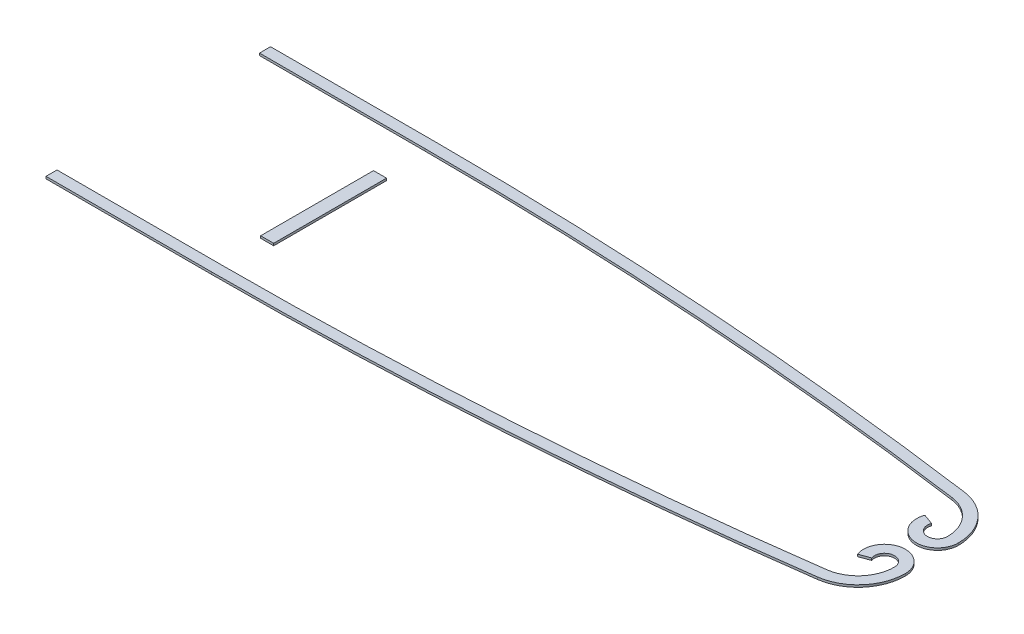
ISO-10303-21;
HEADER;
FILE_DESCRIPTION(('STEP AP214'),'2;1');
FILE_NAME('part.step','',(''),(''),'','','');
FILE_SCHEMA(('AUTOMOTIVE_DESIGN { 1 0 10303 214 1 1 1 1 }'));
ENDSEC;
DATA;
#1=APPLICATION_CONTEXT('core data for automotive mechanical design processes');
#2=APPLICATION_PROTOCOL_DEFINITION('international standard','automotive_design',2000,#1);
#3=PRODUCT_CONTEXT('',#1,'mechanical');
#4=PRODUCT('Part','Part','',(#3));
#5=PRODUCT_RELATED_PRODUCT_CATEGORY('part','',(#4));
#6=PRODUCT_DEFINITION_FORMATION('','',#4);
#7=PRODUCT_DEFINITION_CONTEXT('part definition',#1,'design');
#8=PRODUCT_DEFINITION('design','',#6,#7);
#9=PRODUCT_DEFINITION_SHAPE('','',#8);
#10=(LENGTH_UNIT() NAMED_UNIT(*) SI_UNIT(.MILLI.,.METRE.));
#11=(NAMED_UNIT(*) PLANE_ANGLE_UNIT() SI_UNIT($,.RADIAN.));
#12=(NAMED_UNIT(*) SI_UNIT($,.STERADIAN.) SOLID_ANGLE_UNIT());
#13=UNCERTAINTY_MEASURE_WITH_UNIT(LENGTH_MEASURE(1.E-05),#10,'distance_accuracy_value','');
#14=(GEOMETRIC_REPRESENTATION_CONTEXT(3) GLOBAL_UNCERTAINTY_ASSIGNED_CONTEXT((#13)) GLOBAL_UNIT_ASSIGNED_CONTEXT((#10,
#11,#12)) REPRESENTATION_CONTEXT('',''));
#15=CARTESIAN_POINT('',(0.,0.,0.));
#16=DIRECTION('',(0.,0.,1.));
#17=DIRECTION('',(1.,0.,0.));
#18=AXIS2_PLACEMENT_3D('',#15,#16,#17);
#19=CARTESIAN_POINT('',(266.48,0.5,12.025));
#20=DIRECTION('',(0.,-1.,0.));
#21=DIRECTION('',(0.,0.,-1.));
#22=AXIS2_PLACEMENT_3D('',#19,#20,#21);
#23=CYLINDRICAL_SURFACE('',#22,9.52500000000004);
#24=CARTESIAN_POINT('',(266.48,-0.5,12.025));
#25=DIRECTION('',(0.,1.,0.));
#26=DIRECTION('',(0.,0.,1.));
#27=AXIS2_PLACEMENT_3D('',#24,#25,#26);
#28=CIRCLE('',#27,9.52500000000004);
#29=CARTESIAN_POINT('',(276.005,-0.5,12.025));
#30=VERTEX_POINT('',#29);
#31=CARTESIAN_POINT('',(257.529259033058,-0.5,15.2822781801222));
#32=VERTEX_POINT('',#31);
#33=EDGE_CURVE('E150',#30,#32,#28,.T.);
#34=ORIENTED_EDGE('',*,*,#33,.T.);
#35=DIRECTION('',(0.,-1.,0.));
#36=VECTOR('',#35,1.);
#37=CARTESIAN_POINT('',(257.529259033058,0.5,15.2822781801222));
#38=LINE('',#37,#36);
#39=CARTESIAN_POINT('',(257.529259033058,0.5,15.2822781801222));
#40=VERTEX_POINT('',#39);
#41=EDGE_CURVE('E12',#40,#32,#38,.T.);
#42=ORIENTED_EDGE('',*,*,#41,.F.);
#43=CARTESIAN_POINT('',(266.48,0.5,12.025));
#44=DIRECTION('',(0.,1.,0.));
#45=DIRECTION('',(0.,0.,1.));
#46=AXIS2_PLACEMENT_3D('',#43,#44,#45);
#47=CIRCLE('',#46,9.52500000000004);
#48=CARTESIAN_POINT('',(276.005,0.5,12.025));
#49=VERTEX_POINT('',#48);
#50=EDGE_CURVE('E168',#49,#40,#47,.T.);
#51=ORIENTED_EDGE('',*,*,#50,.F.);
#52=DIRECTION('',(0.,-1.,0.));
#53=VECTOR('',#52,1.);
#54=CARTESIAN_POINT('',(276.005,0.5,12.025));
#55=LINE('',#54,#53);
#56=EDGE_CURVE('E146',#49,#30,#55,.T.);
#57=ORIENTED_EDGE('',*,*,#56,.T.);
#58=EDGE_LOOP('',(#34,#42,#51,#57));
#59=FACE_BOUND('',#58,.T.);
#60=ADVANCED_FACE('F42',(#59),#23,.T.);
#61=CARTESIAN_POINT('',(262.227810721741,0.5,13.5724208677221));
#62=DIRECTION('',(-0.341971462480017,0.,-0.93971033773673));
#63=DIRECTION('',(-0.93971033773673,0.,0.341971462480017));
#64=AXIS2_PLACEMENT_3D('',#61,#62,#63);
#65=PLANE('',#64);
#66=DIRECTION('',(0.93971033773673,0.,-0.341971462480017));
#67=VECTOR('',#66,1.);
#68=CARTESIAN_POINT('',(262.227810721741,-0.5,13.5724208677221));
#69=LINE('',#68,#67);
#70=CARTESIAN_POINT('',(262.227810721741,-0.5,13.5724208677221));
#71=VERTEX_POINT('',#70);
#72=EDGE_CURVE('E153',#32,#71,#69,.T.);
#73=ORIENTED_EDGE('',*,*,#72,.T.);
#74=DIRECTION('',(0.,-1.,0.));
#75=VECTOR('',#74,1.);
#76=CARTESIAN_POINT('',(262.227810721741,0.5,13.5724208677221));
#77=LINE('',#76,#75);
#78=CARTESIAN_POINT('',(262.227810721741,0.5,13.5724208677221));
#79=VERTEX_POINT('',#78);
#80=EDGE_CURVE('E50',#79,#71,#77,.T.);
#81=ORIENTED_EDGE('',*,*,#80,.F.);
#82=DIRECTION('',(0.93971033773673,0.,-0.341971462480017));
#83=VECTOR('',#82,1.);
#84=CARTESIAN_POINT('',(262.227810721741,0.5,13.5724208677221));
#85=LINE('',#84,#83);
#86=EDGE_CURVE('E107',#40,#79,#85,.T.);
#87=ORIENTED_EDGE('',*,*,#86,.F.);
#88=ORIENTED_EDGE('',*,*,#41,.T.);
#89=EDGE_LOOP('',(#73,#81,#87,#88));
#90=FACE_BOUND('',#89,.T.);
#91=ADVANCED_FACE('F217',(#90),#65,.F.);
#92=CARTESIAN_POINT('',(266.48,0.5,12.025));
#93=DIRECTION('',(0.,-1.,0.));
#94=DIRECTION('',(0.,0.,-1.));
#95=AXIS2_PLACEMENT_3D('',#92,#93,#94);
#96=CYLINDRICAL_SURFACE('',#95,4.52500000000003);
#97=CARTESIAN_POINT('',(266.48,-0.5,12.025));
#98=DIRECTION('',(0.,-1.,0.));
#99=DIRECTION('',(0.,0.,1.));
#100=AXIS2_PLACEMENT_3D('',#97,#98,#99);
#101=CIRCLE('',#100,4.52500000000003);
#102=CARTESIAN_POINT('',(271.005,-0.5,12.0250000000001));
#103=VERTEX_POINT('',#102);
#104=EDGE_CURVE('E155',#71,#103,#101,.T.);
#105=ORIENTED_EDGE('',*,*,#104,.T.);
#106=DIRECTION('',(0.,-1.,0.));
#107=VECTOR('',#106,1.);
#108=CARTESIAN_POINT('',(271.005,0.5,12.0250000000001));
#109=LINE('',#108,#107);
#110=CARTESIAN_POINT('',(271.005,0.5,12.0250000000001));
#111=VERTEX_POINT('',#110);
#112=EDGE_CURVE('E181',#111,#103,#109,.T.);
#113=ORIENTED_EDGE('',*,*,#112,.F.);
#114=CARTESIAN_POINT('',(266.48,0.5,12.025));
#115=DIRECTION('',(0.,-1.,0.));
#116=DIRECTION('',(0.,0.,1.));
#117=AXIS2_PLACEMENT_3D('',#114,#115,#116);
#118=CIRCLE('',#117,4.52500000000003);
#119=EDGE_CURVE('E189',#79,#111,#118,.T.);
#120=ORIENTED_EDGE('',*,*,#119,.F.);
#121=ORIENTED_EDGE('',*,*,#80,.T.);
#122=EDGE_LOOP('',(#105,#113,#120,#121));
#123=FACE_BOUND('',#122,.T.);
#124=ADVANCED_FACE('F187',(#123),#96,.F.);
#125=CARTESIAN_POINT('',(254.503693875289,0.5,12.0249999999999));
#126=DIRECTION('',(0.,-1.,0.));
#127=DIRECTION('',(0.,0.,-1.));
#128=AXIS2_PLACEMENT_3D('',#125,#126,#127);
#129=CYLINDRICAL_SURFACE('',#128,16.5013061247105);
#130=CARTESIAN_POINT('',(254.503693875289,-0.5,12.0249999999999));
#131=DIRECTION('',(0.,-1.,0.));
#132=DIRECTION('',(0.,0.,1.));
#133=AXIS2_PLACEMENT_3D('',#130,#131,#132);
#134=CIRCLE('',#133,16.5013061247105);
#135=CARTESIAN_POINT('',(256.750244877647,-0.5,28.3726638213298));
#136=VERTEX_POINT('',#135);
#137=EDGE_CURVE('E157',#103,#136,#134,.T.);
#138=ORIENTED_EDGE('',*,*,#137,.T.);
#139=DIRECTION('',(0.,-1.,0.));
#140=VECTOR('',#139,1.);
#141=CARTESIAN_POINT('',(256.750244877647,0.5,28.3726638213298));
#142=LINE('',#141,#140);
#143=CARTESIAN_POINT('',(256.750244877647,0.5,28.3726638213298));
#144=VERTEX_POINT('',#143);
#145=EDGE_CURVE('E178',#144,#136,#142,.T.);
#146=ORIENTED_EDGE('',*,*,#145,.F.);
#147=CARTESIAN_POINT('',(254.503693875289,0.5,12.0249999999999));
#148=DIRECTION('',(0.,-1.,0.));
#149=DIRECTION('',(0.,0.,1.));
#150=AXIS2_PLACEMENT_3D('',#147,#148,#149);
#151=CIRCLE('',#150,16.5013061247105);
#152=EDGE_CURVE('E207',#111,#144,#151,.T.);
#153=ORIENTED_EDGE('',*,*,#152,.F.);
#154=ORIENTED_EDGE('',*,*,#112,.T.);
#155=EDGE_LOOP('',(#138,#146,#153,#154));
#156=FACE_BOUND('',#155,.T.);
#157=ADVANCED_FACE('F198',(#156),#129,.F.);
#158=CARTESIAN_POINT('',(0.,0.5,-1839.94311663476));
#159=DIRECTION('',(0.,-1.,0.));
#160=DIRECTION('',(0.,0.,-1.));
#161=AXIS2_PLACEMENT_3D('',#158,#159,#160);
#162=CYLINDRICAL_SURFACE('',#161,1885.87500745568);
#163=CARTESIAN_POINT('',(0.,-0.5,-1839.94311663476));
#164=DIRECTION('',(0.,-1.,0.));
#165=DIRECTION('',(0.,0.,1.));
#166=AXIS2_PLACEMENT_3D('',#163,#164,#165);
#167=CIRCLE('',#166,1885.87500745568);
#168=CARTESIAN_POINT('',(0.,-0.5,45.931890820925));
#169=VERTEX_POINT('',#168);
#170=EDGE_CURVE('E159',#136,#169,#167,.T.);
#171=ORIENTED_EDGE('',*,*,#170,.T.);
#172=DIRECTION('',(0.,-1.,0.));
#173=VECTOR('',#172,1.);
#174=CARTESIAN_POINT('',(0.,0.5,45.931890820925));
#175=LINE('',#174,#173);
#176=CARTESIAN_POINT('',(0.,0.5,45.931890820925));
#177=VERTEX_POINT('',#176);
#178=EDGE_CURVE('E175',#177,#169,#175,.T.);
#179=ORIENTED_EDGE('',*,*,#178,.F.);
#180=CARTESIAN_POINT('',(0.,0.5,-1839.94311663476));
#181=DIRECTION('',(0.,-1.,0.));
#182=DIRECTION('',(0.,0.,1.));
#183=AXIS2_PLACEMENT_3D('',#180,#181,#182);
#184=CIRCLE('',#183,1885.87500745568);
#185=EDGE_CURVE('E204',#144,#177,#184,.T.);
#186=ORIENTED_EDGE('',*,*,#185,.F.);
#187=ORIENTED_EDGE('',*,*,#145,.T.);
#188=EDGE_LOOP('',(#171,#179,#186,#187));
#189=FACE_BOUND('',#188,.T.);
#190=ADVANCED_FACE('F202',(#189),#162,.F.);
#191=CARTESIAN_POINT('',(-3.03271831394858E-13,0.5,45.931890820925));
#192=DIRECTION('',(0.,0.,1.));
#193=DIRECTION('',(1.,0.,0.));
#194=AXIS2_PLACEMENT_3D('',#191,#192,#193);
#195=PLANE('',#194);
#196=DIRECTION('',(-1.,0.,0.));
#197=VECTOR('',#196,1.);
#198=CARTESIAN_POINT('',(-3.03271831394858E-13,-0.5,45.931890820925));
#199=LINE('',#198,#197);
#200=CARTESIAN_POINT('',(-75.0000000000002,-0.5,45.9318908209251));
#201=VERTEX_POINT('',#200);
#202=EDGE_CURVE('E161',#169,#201,#199,.T.);
#203=ORIENTED_EDGE('',*,*,#202,.T.);
#204=DIRECTION('',(0.,-1.,0.));
#205=VECTOR('',#204,1.);
#206=CARTESIAN_POINT('',(-75.0000000000002,0.5,45.9318908209251));
#207=LINE('',#206,#205);
#208=CARTESIAN_POINT('',(-75.0000000000002,0.5,45.9318908209251));
#209=VERTEX_POINT('',#208);
#210=EDGE_CURVE('E172',#209,#201,#207,.T.);
#211=ORIENTED_EDGE('',*,*,#210,.F.);
#212=DIRECTION('',(-1.,0.,0.));
#213=VECTOR('',#212,1.);
#214=CARTESIAN_POINT('',(-3.03271831394858E-13,0.5,45.931890820925));
#215=LINE('',#214,#213);
#216=EDGE_CURVE('E206',#177,#209,#215,.T.);
#217=ORIENTED_EDGE('',*,*,#216,.F.);
#218=ORIENTED_EDGE('',*,*,#178,.T.);
#219=EDGE_LOOP('',(#203,#211,#217,#218));
#220=FACE_BOUND('',#219,.T.);
#221=ADVANCED_FACE('F229',(#220),#195,.F.);
#222=CARTESIAN_POINT('',(-75.0000000000002,0.5,50.9318908209252));
#223=DIRECTION('',(1.,0.,0.));
#224=DIRECTION('',(0.,0.,-1.));
#225=AXIS2_PLACEMENT_3D('',#222,#223,#224);
#226=PLANE('',#225);
#227=DIRECTION('',(0.,0.,1.));
#228=VECTOR('',#227,1.);
#229=CARTESIAN_POINT('',(-75.0000000000002,-0.5,50.9318908209252));
#230=LINE('',#229,#228);
#231=CARTESIAN_POINT('',(-75.0000000000002,-0.5,50.9318908209252));
#232=VERTEX_POINT('',#231);
#233=EDGE_CURVE('E163',#201,#232,#230,.T.);
#234=ORIENTED_EDGE('',*,*,#233,.T.);
#235=DIRECTION('',(0.,-1.,0.));
#236=VECTOR('',#235,1.);
#237=CARTESIAN_POINT('',(-75.0000000000002,0.5,50.9318908209252));
#238=LINE('',#237,#236);
#239=CARTESIAN_POINT('',(-75.0000000000002,0.5,50.9318908209252));
#240=VERTEX_POINT('',#239);
#241=EDGE_CURVE('E141',#240,#232,#238,.T.);
#242=ORIENTED_EDGE('',*,*,#241,.F.);
#243=DIRECTION('',(0.,0.,1.));
#244=VECTOR('',#243,1.);
#245=CARTESIAN_POINT('',(-75.0000000000002,0.5,50.9318908209252));
#246=LINE('',#245,#244);
#247=EDGE_CURVE('E132',#209,#240,#246,.T.);
#248=ORIENTED_EDGE('',*,*,#247,.F.);
#249=ORIENTED_EDGE('',*,*,#210,.T.);
#250=EDGE_LOOP('',(#234,#242,#248,#249));
#251=FACE_BOUND('',#250,.T.);
#252=ADVANCED_FACE('F232',(#251),#226,.F.);
#253=CARTESIAN_POINT('',(-2.31565402546833E-13,0.5,50.9318908209251));
#254=DIRECTION('',(0.,0.,-1.));
#255=DIRECTION('',(-1.,0.,0.));
#256=AXIS2_PLACEMENT_3D('',#253,#254,#255);
#257=PLANE('',#256);
#258=DIRECTION('',(1.,0.,0.));
#259=VECTOR('',#258,1.);
#260=CARTESIAN_POINT('',(-2.31565402546833E-13,-0.5,50.9318908209251));
#261=LINE('',#260,#259);
#262=CARTESIAN_POINT('',(-2.31565402546833E-13,-0.5,50.9318908209251));
#263=VERTEX_POINT('',#262);
#264=EDGE_CURVE('E140',#232,#263,#261,.T.);
#265=ORIENTED_EDGE('',*,*,#264,.T.);
#266=DIRECTION('',(0.,-1.,0.));
#267=VECTOR('',#266,1.);
#268=CARTESIAN_POINT('',(-2.31565402546833E-13,0.5,50.9318908209251));
#269=LINE('',#268,#267);
#270=CARTESIAN_POINT('',(-2.31565402546833E-13,0.5,50.9318908209251));
#271=VERTEX_POINT('',#270);
#272=EDGE_CURVE('E137',#271,#263,#269,.T.);
#273=ORIENTED_EDGE('',*,*,#272,.F.);
#274=DIRECTION('',(1.,0.,0.));
#275=VECTOR('',#274,1.);
#276=CARTESIAN_POINT('',(-2.31565402546833E-13,0.5,50.9318908209251));
#277=LINE('',#276,#275);
#278=EDGE_CURVE('E126',#240,#271,#277,.T.);
#279=ORIENTED_EDGE('',*,*,#278,.F.);
#280=ORIENTED_EDGE('',*,*,#241,.T.);
#281=EDGE_LOOP('',(#265,#273,#279,#280));
#282=FACE_BOUND('',#281,.T.);
#283=ADVANCED_FACE('F138',(#282),#257,.F.);
#284=CARTESIAN_POINT('',(0.,0.5,-1839.94311663476));
#285=DIRECTION('',(0.,-1.,0.));
#286=DIRECTION('',(0.,0.,-1.));
#287=AXIS2_PLACEMENT_3D('',#284,#285,#286);
#288=CYLINDRICAL_SURFACE('',#287,1890.87500745568);
#289=CARTESIAN_POINT('',(0.,-0.5,-1839.94311663476));
#290=DIRECTION('',(0.,1.,0.));
#291=DIRECTION('',(0.,0.,1.));
#292=AXIS2_PLACEMENT_3D('',#289,#290,#291);
#293=CIRCLE('',#292,1890.87500745568);
#294=CARTESIAN_POINT('',(257.430964023568,-0.5,33.3261092327961));
#295=VERTEX_POINT('',#294);
#296=EDGE_CURVE('E93',#263,#295,#293,.T.);
#297=ORIENTED_EDGE('',*,*,#296,.T.);
#298=DIRECTION('',(0.,-1.,0.));
#299=VECTOR('',#298,1.);
#300=CARTESIAN_POINT('',(257.430964023568,0.5,33.3261092327961));
#301=LINE('',#300,#299);
#302=CARTESIAN_POINT('',(257.430964023568,0.5,33.3261092327961));
#303=VERTEX_POINT('',#302);
#304=EDGE_CURVE('E142',#303,#295,#301,.T.);
#305=ORIENTED_EDGE('',*,*,#304,.F.);
#306=CARTESIAN_POINT('',(0.,0.5,-1839.94311663476));
#307=DIRECTION('',(0.,1.,0.));
#308=DIRECTION('',(0.,0.,1.));
#309=AXIS2_PLACEMENT_3D('',#306,#307,#308);
#310=CIRCLE('',#309,1890.87500745568);
#311=EDGE_CURVE('E130',#271,#303,#310,.T.);
#312=ORIENTED_EDGE('',*,*,#311,.F.);
#313=ORIENTED_EDGE('',*,*,#272,.T.);
#314=EDGE_LOOP('',(#297,#305,#312,#313));
#315=FACE_BOUND('',#314,.T.);
#316=ADVANCED_FACE('F144',(#315),#288,.T.);
#317=CARTESIAN_POINT('',(254.503693875289,0.5,12.0249999999999));
#318=DIRECTION('',(0.,-1.,0.));
#319=DIRECTION('',(0.,0.,-1.));
#320=AXIS2_PLACEMENT_3D('',#317,#318,#319);
#321=CYLINDRICAL_SURFACE('',#320,21.5013061247105);
#322=CARTESIAN_POINT('',(254.503693875289,-0.5,12.0249999999999));
#323=DIRECTION('',(0.,1.,0.));
#324=DIRECTION('',(0.,0.,1.));
#325=AXIS2_PLACEMENT_3D('',#322,#323,#324);
#326=CIRCLE('',#325,21.5013061247105);
#327=EDGE_CURVE('E99',#295,#30,#326,.T.);
#328=ORIENTED_EDGE('',*,*,#327,.T.);
#329=ORIENTED_EDGE('',*,*,#56,.F.);
#330=CARTESIAN_POINT('',(254.503693875289,0.5,12.0249999999999));
#331=DIRECTION('',(0.,1.,0.));
#332=DIRECTION('',(0.,0.,1.));
#333=AXIS2_PLACEMENT_3D('',#330,#331,#332);
#334=CIRCLE('',#333,21.5013061247105);
#335=EDGE_CURVE('E58',#303,#49,#334,.T.);
#336=ORIENTED_EDGE('',*,*,#335,.F.);
#337=ORIENTED_EDGE('',*,*,#304,.T.);
#338=EDGE_LOOP('',(#328,#329,#336,#337));
#339=FACE_BOUND('',#338,.T.);
#340=ADVANCED_FACE('F241',(#339),#321,.T.);
#341=CARTESIAN_POINT('',(266.48,0.5,12.025));
#342=DIRECTION('',(0.,1.,0.));
#343=DIRECTION('',(0.,0.,1.));
#344=AXIS2_PLACEMENT_3D('',#341,#342,#343);
#345=PLANE('',#344);
#346=ORIENTED_EDGE('',*,*,#50,.T.);
#347=ORIENTED_EDGE('',*,*,#86,.T.);
#348=ORIENTED_EDGE('',*,*,#119,.T.);
#349=ORIENTED_EDGE('',*,*,#152,.T.);
#350=ORIENTED_EDGE('',*,*,#185,.T.);
#351=ORIENTED_EDGE('',*,*,#216,.T.);
#352=ORIENTED_EDGE('',*,*,#247,.T.);
#353=ORIENTED_EDGE('',*,*,#278,.T.);
#354=ORIENTED_EDGE('',*,*,#311,.T.);
#355=ORIENTED_EDGE('',*,*,#335,.T.);
#356=EDGE_LOOP('',(#346,#347,#348,#349,#350,#351,#352,#353,#354,#355));
#357=FACE_BOUND('',#356,.T.);
#358=ADVANCED_FACE('F128',(#357),#345,.T.);
#359=CARTESIAN_POINT('',(266.48,-0.5,12.025));
#360=DIRECTION('',(0.,1.,0.));
#361=DIRECTION('',(0.,0.,1.));
#362=AXIS2_PLACEMENT_3D('',#359,#360,#361);
#363=PLANE('',#362);
#364=ORIENTED_EDGE('',*,*,#33,.F.);
#365=ORIENTED_EDGE('',*,*,#327,.F.);
#366=ORIENTED_EDGE('',*,*,#296,.F.);
#367=ORIENTED_EDGE('',*,*,#264,.F.);
#368=ORIENTED_EDGE('',*,*,#233,.F.);
#369=ORIENTED_EDGE('',*,*,#202,.F.);
#370=ORIENTED_EDGE('',*,*,#170,.F.);
#371=ORIENTED_EDGE('',*,*,#137,.F.);
#372=ORIENTED_EDGE('',*,*,#104,.F.);
#373=ORIENTED_EDGE('',*,*,#72,.F.);
#374=EDGE_LOOP('',(#364,#365,#366,#367,#368,#369,#370,#371,#372,#373));
#375=FACE_BOUND('',#374,.T.);
#376=ADVANCED_FACE('F193',(#375),#363,.F.);
#377=CLOSED_SHELL('',(#60,#91,#124,#157,#190,#221,#252,#283,#316,#340,#358,#376));
#378=MANIFOLD_SOLID_BREP('B2',#377);
#379=CARTESIAN_POINT('',(0.,0.5,1839.94311663476));
#380=DIRECTION('',(0.,-1.,0.));
#381=DIRECTION('',(0.,0.,-1.));
#382=AXIS2_PLACEMENT_3D('',#379,#380,#381);
#383=CYLINDRICAL_SURFACE('',#382,1890.87500745568);
#384=CARTESIAN_POINT('',(0.,-0.5,1839.94311663476));
#385=DIRECTION('',(0.,1.,0.));
#386=DIRECTION('',(0.,0.,-1.));
#387=AXIS2_PLACEMENT_3D('',#384,#385,#386);
#388=CIRCLE('',#387,1890.87500745568);
#389=CARTESIAN_POINT('',(257.430964023568,-0.5,-33.3261092327961));
#390=VERTEX_POINT('',#389);
#391=CARTESIAN_POINT('',(-2.31565402546833E-13,-0.5,-50.9318908209251));
#392=VERTEX_POINT('',#391);
#393=EDGE_CURVE('E439',#390,#392,#388,.T.);
#394=ORIENTED_EDGE('',*,*,#393,.T.);
#395=DIRECTION('',(0.,-1.,0.));
#396=VECTOR('',#395,1.);
#397=CARTESIAN_POINT('',(-2.31565402546833E-13,0.5,-50.9318908209251));
#398=LINE('',#397,#396);
#399=CARTESIAN_POINT('',(-2.31565402546833E-13,0.5,-50.9318908209251));
#400=VERTEX_POINT('',#399);
#401=EDGE_CURVE('E40',#400,#392,#398,.T.);
#402=ORIENTED_EDGE('',*,*,#401,.F.);
#403=CARTESIAN_POINT('',(0.,0.5,1839.94311663476));
#404=DIRECTION('',(0.,1.,0.));
#405=DIRECTION('',(0.,0.,-1.));
#406=AXIS2_PLACEMENT_3D('',#403,#404,#405);
#407=CIRCLE('',#406,1890.87500745568);
#408=CARTESIAN_POINT('',(257.430964023568,0.5,-33.3261092327961));
#409=VERTEX_POINT('',#408);
#410=EDGE_CURVE('E457',#409,#400,#407,.T.);
#411=ORIENTED_EDGE('',*,*,#410,.F.);
#412=DIRECTION('',(0.,-1.,0.));
#413=VECTOR('',#412,1.);
#414=CARTESIAN_POINT('',(257.430964023568,0.5,-33.3261092327961));
#415=LINE('',#414,#413);
#416=EDGE_CURVE('E435',#409,#390,#415,.T.);
#417=ORIENTED_EDGE('',*,*,#416,.T.);
#418=EDGE_LOOP('',(#394,#402,#411,#417));
#419=FACE_BOUND('',#418,.T.);
#420=ADVANCED_FACE('F331',(#419),#383,.T.);
#421=CARTESIAN_POINT('',(-2.31565402546833E-13,0.5,-50.9318908209251));
#422=DIRECTION('',(0.,0.,1.));
#423=DIRECTION('',(1.,0.,0.));
#424=AXIS2_PLACEMENT_3D('',#421,#422,#423);
#425=PLANE('',#424);
#426=DIRECTION('',(-1.,0.,0.));
#427=VECTOR('',#426,1.);
#428=CARTESIAN_POINT('',(-2.31565402546833E-13,-0.5,-50.9318908209251));
#429=LINE('',#428,#427);
#430=CARTESIAN_POINT('',(-75.0000000000002,-0.5,-50.9318908209252));
#431=VERTEX_POINT('',#430);
#432=EDGE_CURVE('E442',#392,#431,#429,.T.);
#433=ORIENTED_EDGE('',*,*,#432,.T.);
#434=DIRECTION('',(0.,-1.,0.));
#435=VECTOR('',#434,1.);
#436=CARTESIAN_POINT('',(-75.0000000000002,0.5,-50.9318908209252));
#437=LINE('',#436,#435);
#438=CARTESIAN_POINT('',(-75.0000000000002,0.5,-50.9318908209252));
#439=VERTEX_POINT('',#438);
#440=EDGE_CURVE('E339',#439,#431,#437,.T.);
#441=ORIENTED_EDGE('',*,*,#440,.F.);
#442=DIRECTION('',(-1.,0.,0.));
#443=VECTOR('',#442,1.);
#444=CARTESIAN_POINT('',(-2.31565402546833E-13,0.5,-50.9318908209251));
#445=LINE('',#444,#443);
#446=EDGE_CURVE('E396',#400,#439,#445,.T.);
#447=ORIENTED_EDGE('',*,*,#446,.F.);
#448=ORIENTED_EDGE('',*,*,#401,.T.);
#449=EDGE_LOOP('',(#433,#441,#447,#448));
#450=FACE_BOUND('',#449,.T.);
#451=ADVANCED_FACE('F506',(#450),#425,.F.);
#452=CARTESIAN_POINT('',(-75.0000000000002,0.5,-50.9318908209252));
#453=DIRECTION('',(1.,0.,0.));
#454=DIRECTION('',(0.,0.,-1.));
#455=AXIS2_PLACEMENT_3D('',#452,#453,#454);
#456=PLANE('',#455);
#457=DIRECTION('',(0.,0.,1.));
#458=VECTOR('',#457,1.);
#459=CARTESIAN_POINT('',(-75.0000000000002,-0.5,-50.9318908209252));
#460=LINE('',#459,#458);
#461=CARTESIAN_POINT('',(-75.0000000000002,-0.5,-45.9318908209251));
#462=VERTEX_POINT('',#461);
#463=EDGE_CURVE('E444',#431,#462,#460,.T.);
#464=ORIENTED_EDGE('',*,*,#463,.T.);
#465=DIRECTION('',(0.,-1.,0.));
#466=VECTOR('',#465,1.);
#467=CARTESIAN_POINT('',(-75.0000000000002,0.5,-45.9318908209251));
#468=LINE('',#467,#466);
#469=CARTESIAN_POINT('',(-75.0000000000002,0.5,-45.9318908209251));
#470=VERTEX_POINT('',#469);
#471=EDGE_CURVE('E470',#470,#462,#468,.T.);
#472=ORIENTED_EDGE('',*,*,#471,.F.);
#473=DIRECTION('',(0.,0.,1.));
#474=VECTOR('',#473,1.);
#475=CARTESIAN_POINT('',(-75.0000000000002,0.5,-50.9318908209252));
#476=LINE('',#475,#474);
#477=EDGE_CURVE('E478',#439,#470,#476,.T.);
#478=ORIENTED_EDGE('',*,*,#477,.F.);
#479=ORIENTED_EDGE('',*,*,#440,.T.);
#480=EDGE_LOOP('',(#464,#472,#478,#479));
#481=FACE_BOUND('',#480,.T.);
#482=ADVANCED_FACE('F476',(#481),#456,.F.);
#483=CARTESIAN_POINT('',(-3.03271831394858E-13,0.5,-45.931890820925));
#484=DIRECTION('',(0.,0.,-1.));
#485=DIRECTION('',(-1.,0.,0.));
#486=AXIS2_PLACEMENT_3D('',#483,#484,#485);
#487=PLANE('',#486);
#488=DIRECTION('',(1.,0.,0.));
#489=VECTOR('',#488,1.);
#490=CARTESIAN_POINT('',(-3.03271831394858E-13,-0.5,-45.931890820925));
#491=LINE('',#490,#489);
#492=CARTESIAN_POINT('',(-3.03271831394858E-13,-0.5,-45.931890820925));
#493=VERTEX_POINT('',#492);
#494=EDGE_CURVE('E446',#462,#493,#491,.T.);
#495=ORIENTED_EDGE('',*,*,#494,.T.);
#496=DIRECTION('',(0.,-1.,0.));
#497=VECTOR('',#496,1.);
#498=CARTESIAN_POINT('',(-3.03271831394858E-13,0.5,-45.931890820925));
#499=LINE('',#498,#497);
#500=CARTESIAN_POINT('',(-3.03271831394858E-13,0.5,-45.931890820925));
#501=VERTEX_POINT('',#500);
#502=EDGE_CURVE('E467',#501,#493,#499,.T.);
#503=ORIENTED_EDGE('',*,*,#502,.F.);
#504=DIRECTION('',(1.,0.,0.));
#505=VECTOR('',#504,1.);
#506=CARTESIAN_POINT('',(-3.03271831394858E-13,0.5,-45.931890820925));
#507=LINE('',#506,#505);
#508=EDGE_CURVE('E496',#470,#501,#507,.T.);
#509=ORIENTED_EDGE('',*,*,#508,.F.);
#510=ORIENTED_EDGE('',*,*,#471,.T.);
#511=EDGE_LOOP('',(#495,#503,#509,#510));
#512=FACE_BOUND('',#511,.T.);
#513=ADVANCED_FACE('F487',(#512),#487,.F.);
#514=CARTESIAN_POINT('',(0.,0.5,1839.94311663476));
#515=DIRECTION('',(0.,-1.,0.));
#516=DIRECTION('',(0.,0.,-1.));
#517=AXIS2_PLACEMENT_3D('',#514,#515,#516);
#518=CYLINDRICAL_SURFACE('',#517,1885.87500745568);
#519=CARTESIAN_POINT('',(0.,-0.5,1839.94311663476));
#520=DIRECTION('',(0.,-1.,0.));
#521=DIRECTION('',(0.,0.,-1.));
#522=AXIS2_PLACEMENT_3D('',#519,#520,#521);
#523=CIRCLE('',#522,1885.87500745568);
#524=CARTESIAN_POINT('',(256.750244877647,-0.5,-28.37266382133));
#525=VERTEX_POINT('',#524);
#526=EDGE_CURVE('E448',#493,#525,#523,.T.);
#527=ORIENTED_EDGE('',*,*,#526,.T.);
#528=DIRECTION('',(0.,-1.,0.));
#529=VECTOR('',#528,1.);
#530=CARTESIAN_POINT('',(256.750244877647,0.5,-28.37266382133));
#531=LINE('',#530,#529);
#532=CARTESIAN_POINT('',(256.750244877647,0.5,-28.37266382133));
#533=VERTEX_POINT('',#532);
#534=EDGE_CURVE('E464',#533,#525,#531,.T.);
#535=ORIENTED_EDGE('',*,*,#534,.F.);
#536=CARTESIAN_POINT('',(0.,0.5,1839.94311663476));
#537=DIRECTION('',(0.,-1.,0.));
#538=DIRECTION('',(0.,0.,-1.));
#539=AXIS2_PLACEMENT_3D('',#536,#537,#538);
#540=CIRCLE('',#539,1885.87500745568);
#541=EDGE_CURVE('E493',#501,#533,#540,.T.);
#542=ORIENTED_EDGE('',*,*,#541,.F.);
#543=ORIENTED_EDGE('',*,*,#502,.T.);
#544=EDGE_LOOP('',(#527,#535,#542,#543));
#545=FACE_BOUND('',#544,.T.);
#546=ADVANCED_FACE('F491',(#545),#518,.F.);
#547=CARTESIAN_POINT('',(254.503693875289,0.5,-12.0249999999999));
#548=DIRECTION('',(0.,-1.,0.));
#549=DIRECTION('',(0.,0.,-1.));
#550=AXIS2_PLACEMENT_3D('',#547,#548,#549);
#551=CYLINDRICAL_SURFACE('',#550,16.5013061247105);
#552=CARTESIAN_POINT('',(254.503693875289,-0.5,-12.0249999999999));
#553=DIRECTION('',(0.,-1.,0.));
#554=DIRECTION('',(0.,0.,-1.));
#555=AXIS2_PLACEMENT_3D('',#552,#553,#554);
#556=CIRCLE('',#555,16.5013061247105);
#557=CARTESIAN_POINT('',(271.005,-0.5,-12.025));
#558=VERTEX_POINT('',#557);
#559=EDGE_CURVE('E450',#525,#558,#556,.T.);
#560=ORIENTED_EDGE('',*,*,#559,.T.);
#561=DIRECTION('',(0.,-1.,0.));
#562=VECTOR('',#561,1.);
#563=CARTESIAN_POINT('',(271.005,0.5,-12.025));
#564=LINE('',#563,#562);
#565=CARTESIAN_POINT('',(271.005,0.5,-12.025));
#566=VERTEX_POINT('',#565);
#567=EDGE_CURVE('E461',#566,#558,#564,.T.);
#568=ORIENTED_EDGE('',*,*,#567,.F.);
#569=CARTESIAN_POINT('',(254.503693875289,0.5,-12.0249999999999));
#570=DIRECTION('',(0.,-1.,0.));
#571=DIRECTION('',(0.,0.,-1.));
#572=AXIS2_PLACEMENT_3D('',#569,#570,#571);
#573=CIRCLE('',#572,16.5013061247105);
#574=EDGE_CURVE('E495',#533,#566,#573,.T.);
#575=ORIENTED_EDGE('',*,*,#574,.F.);
#576=ORIENTED_EDGE('',*,*,#534,.T.);
#577=EDGE_LOOP('',(#560,#568,#575,#576));
#578=FACE_BOUND('',#577,.T.);
#579=ADVANCED_FACE('F518',(#578),#551,.F.);
#580=CARTESIAN_POINT('',(266.48,0.5,-12.025));
#581=DIRECTION('',(0.,-1.,0.));
#582=DIRECTION('',(0.,0.,-1.));
#583=AXIS2_PLACEMENT_3D('',#580,#581,#582);
#584=CYLINDRICAL_SURFACE('',#583,4.525);
#585=CARTESIAN_POINT('',(266.48,-0.5,-12.025));
#586=DIRECTION('',(0.,-1.,0.));
#587=DIRECTION('',(0.,0.,-1.));
#588=AXIS2_PLACEMENT_3D('',#585,#586,#587);
#589=CIRCLE('',#588,4.525);
#590=CARTESIAN_POINT('',(262.227810721741,-0.5,-13.5724208677221));
#591=VERTEX_POINT('',#590);
#592=EDGE_CURVE('E452',#558,#591,#589,.T.);
#593=ORIENTED_EDGE('',*,*,#592,.T.);
#594=DIRECTION('',(0.,-1.,0.));
#595=VECTOR('',#594,1.);
#596=CARTESIAN_POINT('',(262.227810721741,0.5,-13.5724208677221));
#597=LINE('',#596,#595);
#598=CARTESIAN_POINT('',(262.227810721741,0.5,-13.5724208677221));
#599=VERTEX_POINT('',#598);
#600=EDGE_CURVE('E430',#599,#591,#597,.T.);
#601=ORIENTED_EDGE('',*,*,#600,.F.);
#602=CARTESIAN_POINT('',(266.48,0.5,-12.025));
#603=DIRECTION('',(0.,-1.,0.));
#604=DIRECTION('',(0.,0.,-1.));
#605=AXIS2_PLACEMENT_3D('',#602,#603,#604);
#606=CIRCLE('',#605,4.525);
#607=EDGE_CURVE('E421',#566,#599,#606,.T.);
#608=ORIENTED_EDGE('',*,*,#607,.F.);
#609=ORIENTED_EDGE('',*,*,#567,.T.);
#610=EDGE_LOOP('',(#593,#601,#608,#609));
#611=FACE_BOUND('',#610,.T.);
#612=ADVANCED_FACE('F521',(#611),#584,.F.);
#613=CARTESIAN_POINT('',(262.227810721741,0.5,-13.5724208677221));
#614=DIRECTION('',(-0.341971462480018,0.,0.939710337736729));
#615=DIRECTION('',(0.939710337736729,0.,0.341971462480018));
#616=AXIS2_PLACEMENT_3D('',#613,#614,#615);
#617=PLANE('',#616);
#618=DIRECTION('',(-0.939710337736729,0.,-0.341971462480018));
#619=VECTOR('',#618,1.);
#620=CARTESIAN_POINT('',(262.227810721741,-0.5,-13.5724208677221));
#621=LINE('',#620,#619);
#622=CARTESIAN_POINT('',(257.529259033058,-0.5,-15.2822781801222));
#623=VERTEX_POINT('',#622);
#624=EDGE_CURVE('E429',#591,#623,#621,.T.);
#625=ORIENTED_EDGE('',*,*,#624,.T.);
#626=DIRECTION('',(0.,-1.,0.));
#627=VECTOR('',#626,1.);
#628=CARTESIAN_POINT('',(257.529259033058,0.5,-15.2822781801222));
#629=LINE('',#628,#627);
#630=CARTESIAN_POINT('',(257.529259033058,0.5,-15.2822781801222));
#631=VERTEX_POINT('',#630);
#632=EDGE_CURVE('E426',#631,#623,#629,.T.);
#633=ORIENTED_EDGE('',*,*,#632,.F.);
#634=DIRECTION('',(-0.939710337736729,0.,-0.341971462480018));
#635=VECTOR('',#634,1.);
#636=CARTESIAN_POINT('',(262.227810721741,0.5,-13.5724208677221));
#637=LINE('',#636,#635);
#638=EDGE_CURVE('E415',#599,#631,#637,.T.);
#639=ORIENTED_EDGE('',*,*,#638,.F.);
#640=ORIENTED_EDGE('',*,*,#600,.T.);
#641=EDGE_LOOP('',(#625,#633,#639,#640));
#642=FACE_BOUND('',#641,.T.);
#643=ADVANCED_FACE('F427',(#642),#617,.F.);
#644=CARTESIAN_POINT('',(266.48,0.5,-12.025));
#645=DIRECTION('',(0.,-1.,0.));
#646=DIRECTION('',(0.,0.,-1.));
#647=AXIS2_PLACEMENT_3D('',#644,#645,#646);
#648=CYLINDRICAL_SURFACE('',#647,9.52500000000004);
#649=CARTESIAN_POINT('',(266.48,-0.5,-12.025));
#650=DIRECTION('',(0.,1.,0.));
#651=DIRECTION('',(0.,0.,-1.));
#652=AXIS2_PLACEMENT_3D('',#649,#650,#651);
#653=CIRCLE('',#652,9.52500000000004);
#654=CARTESIAN_POINT('',(276.005,-0.5,-12.025));
#655=VERTEX_POINT('',#654);
#656=EDGE_CURVE('E382',#623,#655,#653,.T.);
#657=ORIENTED_EDGE('',*,*,#656,.T.);
#658=DIRECTION('',(0.,-1.,0.));
#659=VECTOR('',#658,1.);
#660=CARTESIAN_POINT('',(276.005,0.5,-12.025));
#661=LINE('',#660,#659);
#662=CARTESIAN_POINT('',(276.005,0.5,-12.025));
#663=VERTEX_POINT('',#662);
#664=EDGE_CURVE('E431',#663,#655,#661,.T.);
#665=ORIENTED_EDGE('',*,*,#664,.F.);
#666=CARTESIAN_POINT('',(266.48,0.5,-12.025));
#667=DIRECTION('',(0.,1.,0.));
#668=DIRECTION('',(0.,0.,-1.));
#669=AXIS2_PLACEMENT_3D('',#666,#667,#668);
#670=CIRCLE('',#669,9.52500000000004);
#671=EDGE_CURVE('E419',#631,#663,#670,.T.);
#672=ORIENTED_EDGE('',*,*,#671,.F.);
#673=ORIENTED_EDGE('',*,*,#632,.T.);
#674=EDGE_LOOP('',(#657,#665,#672,#673));
#675=FACE_BOUND('',#674,.T.);
#676=ADVANCED_FACE('F433',(#675),#648,.T.);
#677=CARTESIAN_POINT('',(254.503693875289,0.5,-12.0249999999999));
#678=DIRECTION('',(0.,-1.,0.));
#679=DIRECTION('',(0.,0.,-1.));
#680=AXIS2_PLACEMENT_3D('',#677,#678,#679);
#681=CYLINDRICAL_SURFACE('',#680,21.5013061247105);
#682=CARTESIAN_POINT('',(254.503693875289,-0.5,-12.0249999999999));
#683=DIRECTION('',(0.,1.,0.));
#684=DIRECTION('',(0.,0.,-1.));
#685=AXIS2_PLACEMENT_3D('',#682,#683,#684);
#686=CIRCLE('',#685,21.5013061247105);
#687=EDGE_CURVE('E388',#655,#390,#686,.T.);
#688=ORIENTED_EDGE('',*,*,#687,.T.);
#689=ORIENTED_EDGE('',*,*,#416,.F.);
#690=CARTESIAN_POINT('',(254.503693875289,0.5,-12.0249999999999));
#691=DIRECTION('',(0.,1.,0.));
#692=DIRECTION('',(0.,0.,-1.));
#693=AXIS2_PLACEMENT_3D('',#690,#691,#692);
#694=CIRCLE('',#693,21.5013061247105);
#695=EDGE_CURVE('E347',#663,#409,#694,.T.);
#696=ORIENTED_EDGE('',*,*,#695,.F.);
#697=ORIENTED_EDGE('',*,*,#664,.T.);
#698=EDGE_LOOP('',(#688,#689,#696,#697));
#699=FACE_BOUND('',#698,.T.);
#700=ADVANCED_FACE('F530',(#699),#681,.T.);
#701=CARTESIAN_POINT('',(0.,0.5,1839.94311663476));
#702=DIRECTION('',(0.,-1.,0.));
#703=DIRECTION('',(0.,0.,-1.));
#704=AXIS2_PLACEMENT_3D('',#701,#702,#703);
#705=PLANE('',#704);
#706=ORIENTED_EDGE('',*,*,#410,.T.);
#707=ORIENTED_EDGE('',*,*,#446,.T.);
#708=ORIENTED_EDGE('',*,*,#477,.T.);
#709=ORIENTED_EDGE('',*,*,#508,.T.);
#710=ORIENTED_EDGE('',*,*,#541,.T.);
#711=ORIENTED_EDGE('',*,*,#574,.T.);
#712=ORIENTED_EDGE('',*,*,#607,.T.);
#713=ORIENTED_EDGE('',*,*,#638,.T.);
#714=ORIENTED_EDGE('',*,*,#671,.T.);
#715=ORIENTED_EDGE('',*,*,#695,.T.);
#716=EDGE_LOOP('',(#706,#707,#708,#709,#710,#711,#712,#713,#714,#715));
#717=FACE_BOUND('',#716,.T.);
#718=ADVANCED_FACE('F417',(#717),#705,.F.);
#719=CARTESIAN_POINT('',(0.,-0.5,1839.94311663476));
#720=DIRECTION('',(0.,-1.,0.));
#721=DIRECTION('',(0.,0.,-1.));
#722=AXIS2_PLACEMENT_3D('',#719,#720,#721);
#723=PLANE('',#722);
#724=ORIENTED_EDGE('',*,*,#393,.F.);
#725=ORIENTED_EDGE('',*,*,#687,.F.);
#726=ORIENTED_EDGE('',*,*,#656,.F.);
#727=ORIENTED_EDGE('',*,*,#624,.F.);
#728=ORIENTED_EDGE('',*,*,#592,.F.);
#729=ORIENTED_EDGE('',*,*,#559,.F.);
#730=ORIENTED_EDGE('',*,*,#526,.F.);
#731=ORIENTED_EDGE('',*,*,#494,.F.);
#732=ORIENTED_EDGE('',*,*,#463,.F.);
#733=ORIENTED_EDGE('',*,*,#432,.F.);
#734=EDGE_LOOP('',(#724,#725,#726,#727,#728,#729,#730,#731,#732,#733));
#735=FACE_BOUND('',#734,.T.);
#736=ADVANCED_FACE('F482',(#735),#723,.T.);
#737=CLOSED_SHELL('',(#420,#451,#482,#513,#546,#579,#612,#643,#676,#700,#718,#736));
#738=MANIFOLD_SOLID_BREP('B6',#737);
#739=CARTESIAN_POINT('',(2.955,0.5,25.6));
#740=DIRECTION('',(-1.,0.,0.));
#741=DIRECTION('',(0.,0.,1.));
#742=AXIS2_PLACEMENT_3D('',#739,#740,#741);
#743=PLANE('',#742);
#744=DIRECTION('',(0.,0.,-1.));
#745=VECTOR('',#744,1.);
#746=CARTESIAN_POINT('',(2.955,-0.5,25.6));
#747=LINE('',#746,#745);
#748=CARTESIAN_POINT('',(2.955,-0.5,25.6));
#749=VERTEX_POINT('',#748);
#750=CARTESIAN_POINT('',(2.955,-0.5,-25.6));
#751=VERTEX_POINT('',#750);
#752=EDGE_CURVE('E674',#749,#751,#747,.T.);
#753=ORIENTED_EDGE('',*,*,#752,.T.);
#754=DIRECTION('',(0.,-1.,0.));
#755=VECTOR('',#754,1.);
#756=CARTESIAN_POINT('',(2.955,0.5,-25.6));
#757=LINE('',#756,#755);
#758=CARTESIAN_POINT('',(2.955,0.5,-25.6));
#759=VERTEX_POINT('',#758);
#760=EDGE_CURVE('E329',#759,#751,#757,.T.);
#761=ORIENTED_EDGE('',*,*,#760,.F.);
#762=DIRECTION('',(0.,0.,-1.));
#763=VECTOR('',#762,1.);
#764=CARTESIAN_POINT('',(2.955,0.5,25.6));
#765=LINE('',#764,#763);
#766=CARTESIAN_POINT('',(2.955,0.5,25.6));
#767=VERTEX_POINT('',#766);
#768=EDGE_CURVE('E662',#767,#759,#765,.T.);
#769=ORIENTED_EDGE('',*,*,#768,.F.);
#770=DIRECTION('',(0.,-1.,0.));
#771=VECTOR('',#770,1.);
#772=CARTESIAN_POINT('',(2.955,0.5,25.6));
#773=LINE('',#772,#771);
#774=EDGE_CURVE('E670',#767,#749,#773,.T.);
#775=ORIENTED_EDGE('',*,*,#774,.T.);
#776=EDGE_LOOP('',(#753,#761,#769,#775));
#777=FACE_BOUND('',#776,.T.);
#778=ADVANCED_FACE('F611',(#777),#743,.F.);
#779=CARTESIAN_POINT('',(-2.955,0.5,-25.6));
#780=DIRECTION('',(0.,0.,1.));
#781=DIRECTION('',(1.,0.,0.));
#782=AXIS2_PLACEMENT_3D('',#779,#780,#781);
#783=PLANE('',#782);
#784=DIRECTION('',(-1.,0.,0.));
#785=VECTOR('',#784,1.);
#786=CARTESIAN_POINT('',(-2.955,-0.5,-25.6));
#787=LINE('',#786,#785);
#788=CARTESIAN_POINT('',(-2.955,-0.5,-25.6));
#789=VERTEX_POINT('',#788);
#790=EDGE_CURVE('E666',#751,#789,#787,.T.);
#791=ORIENTED_EDGE('',*,*,#790,.T.);
#792=DIRECTION('',(0.,-1.,0.));
#793=VECTOR('',#792,1.);
#794=CARTESIAN_POINT('',(-2.955,0.5,-25.6));
#795=LINE('',#794,#793);
#796=CARTESIAN_POINT('',(-2.955,0.5,-25.6));
#797=VERTEX_POINT('',#796);
#798=EDGE_CURVE('E619',#797,#789,#795,.T.);
#799=ORIENTED_EDGE('',*,*,#798,.F.);
#800=DIRECTION('',(-1.,0.,0.));
#801=VECTOR('',#800,1.);
#802=CARTESIAN_POINT('',(-2.955,0.5,-25.6));
#803=LINE('',#802,#801);
#804=EDGE_CURVE('E657',#759,#797,#803,.T.);
#805=ORIENTED_EDGE('',*,*,#804,.F.);
#806=ORIENTED_EDGE('',*,*,#760,.T.);
#807=EDGE_LOOP('',(#791,#799,#805,#806));
#808=FACE_BOUND('',#807,.T.);
#809=ADVANCED_FACE('F665',(#808),#783,.F.);
#810=CARTESIAN_POINT('',(-2.955,0.5,25.6));
#811=DIRECTION('',(1.,0.,0.));
#812=DIRECTION('',(0.,0.,-1.));
#813=AXIS2_PLACEMENT_3D('',#810,#811,#812);
#814=PLANE('',#813);
#815=DIRECTION('',(0.,0.,1.));
#816=VECTOR('',#815,1.);
#817=CARTESIAN_POINT('',(-2.955,-0.5,25.6));
#818=LINE('',#817,#816);
#819=CARTESIAN_POINT('',(-2.955,-0.5,25.6));
#820=VERTEX_POINT('',#819);
#821=EDGE_CURVE('E644',#789,#820,#818,.T.);
#822=ORIENTED_EDGE('',*,*,#821,.T.);
#823=DIRECTION('',(0.,-1.,0.));
#824=VECTOR('',#823,1.);
#825=CARTESIAN_POINT('',(-2.955,0.5,25.6));
#826=LINE('',#825,#824);
#827=CARTESIAN_POINT('',(-2.955,0.5,25.6));
#828=VERTEX_POINT('',#827);
#829=EDGE_CURVE('E667',#828,#820,#826,.T.);
#830=ORIENTED_EDGE('',*,*,#829,.F.);
#831=DIRECTION('',(0.,0.,1.));
#832=VECTOR('',#831,1.);
#833=CARTESIAN_POINT('',(-2.955,0.5,25.6));
#834=LINE('',#833,#832);
#835=EDGE_CURVE('E660',#797,#828,#834,.T.);
#836=ORIENTED_EDGE('',*,*,#835,.F.);
#837=ORIENTED_EDGE('',*,*,#798,.T.);
#838=EDGE_LOOP('',(#822,#830,#836,#837));
#839=FACE_BOUND('',#838,.T.);
#840=ADVANCED_FACE('F668',(#839),#814,.F.);
#841=CARTESIAN_POINT('',(-2.955,0.5,25.6));
#842=DIRECTION('',(0.,0.,-1.));
#843=DIRECTION('',(-1.,0.,0.));
#844=AXIS2_PLACEMENT_3D('',#841,#842,#843);
#845=PLANE('',#844);
#846=DIRECTION('',(1.,0.,0.));
#847=VECTOR('',#846,1.);
#848=CARTESIAN_POINT('',(-2.955,-0.5,25.6));
#849=LINE('',#848,#847);
#850=EDGE_CURVE('E650',#820,#749,#849,.T.);
#851=ORIENTED_EDGE('',*,*,#850,.T.);
#852=ORIENTED_EDGE('',*,*,#774,.F.);
#853=DIRECTION('',(1.,0.,0.));
#854=VECTOR('',#853,1.);
#855=CARTESIAN_POINT('',(-2.955,0.5,25.6));
#856=LINE('',#855,#854);
#857=EDGE_CURVE('E627',#828,#767,#856,.T.);
#858=ORIENTED_EDGE('',*,*,#857,.F.);
#859=ORIENTED_EDGE('',*,*,#829,.T.);
#860=EDGE_LOOP('',(#851,#852,#858,#859));
#861=FACE_BOUND('',#860,.T.);
#862=ADVANCED_FACE('F681',(#861),#845,.F.);
#863=CARTESIAN_POINT('',(2.955,0.5,-25.6));
#864=DIRECTION('',(0.,-1.,0.));
#865=DIRECTION('',(0.,0.,-1.));
#866=AXIS2_PLACEMENT_3D('',#863,#864,#865);
#867=PLANE('',#866);
#868=ORIENTED_EDGE('',*,*,#768,.T.);
#869=ORIENTED_EDGE('',*,*,#804,.T.);
#870=ORIENTED_EDGE('',*,*,#835,.T.);
#871=ORIENTED_EDGE('',*,*,#857,.T.);
#872=EDGE_LOOP('',(#868,#869,#870,#871));
#873=FACE_BOUND('',#872,.T.);
#874=ADVANCED_FACE('F658',(#873),#867,.F.);
#875=CARTESIAN_POINT('',(2.955,-0.5,-25.6));
#876=DIRECTION('',(0.,-1.,0.));
#877=DIRECTION('',(0.,0.,-1.));
#878=AXIS2_PLACEMENT_3D('',#875,#876,#877);
#879=PLANE('',#878);
#880=ORIENTED_EDGE('',*,*,#752,.F.);
#881=ORIENTED_EDGE('',*,*,#850,.F.);
#882=ORIENTED_EDGE('',*,*,#821,.F.);
#883=ORIENTED_EDGE('',*,*,#790,.F.);
#884=EDGE_LOOP('',(#880,#881,#882,#883));
#885=FACE_BOUND('',#884,.T.);
#886=ADVANCED_FACE('F684',(#885),#879,.T.);
#887=CLOSED_SHELL('',(#778,#809,#840,#862,#874,#886));
#888=MANIFOLD_SOLID_BREP('B34',#887);
#889=ADVANCED_BREP_SHAPE_REPRESENTATION('',(#18,#378,#738,#888),#14);
#890=SHAPE_DEFINITION_REPRESENTATION(#9,#889);
ENDSEC;
END-ISO-10303-21;
